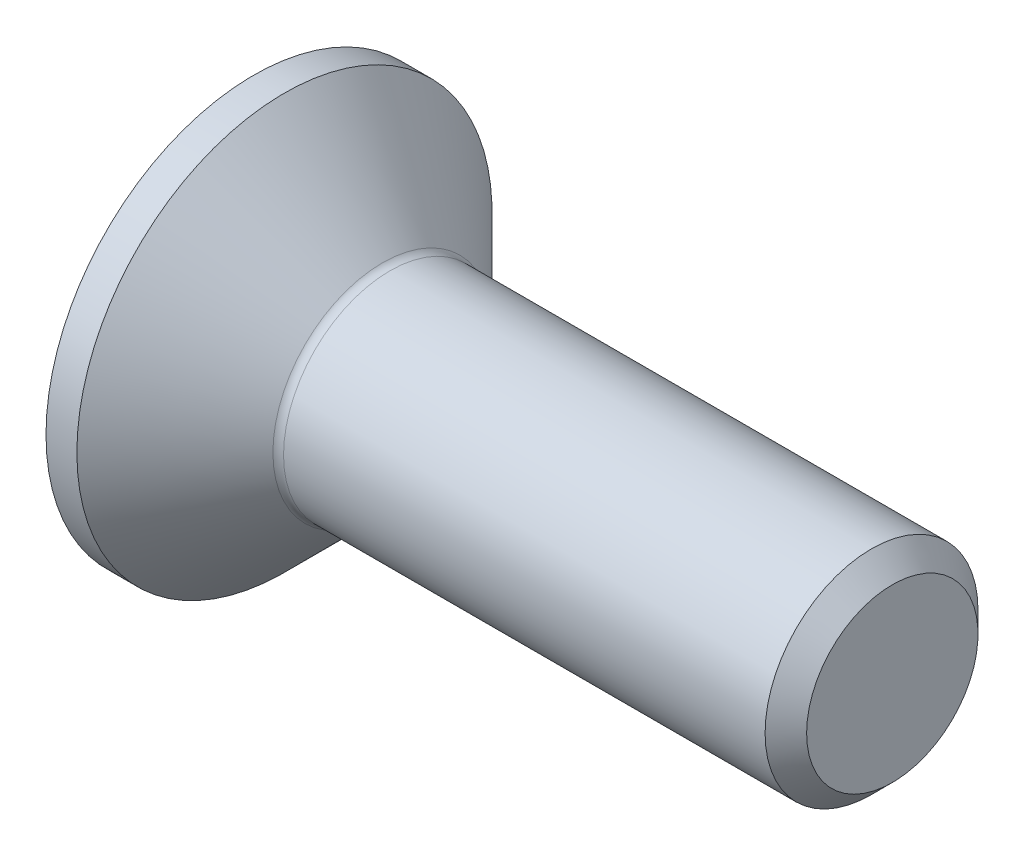
ISO-10303-21;
HEADER;
FILE_DESCRIPTION(('STEP AP214'),'2;1');
FILE_NAME('part.step','',(''),(''),'','','');
FILE_SCHEMA(('AUTOMOTIVE_DESIGN { 1 0 10303 214 1 1 1 1 }'));
ENDSEC;
DATA;
#1=APPLICATION_CONTEXT('core data for automotive mechanical design processes');
#2=APPLICATION_PROTOCOL_DEFINITION('international standard','automotive_design',2000,#1);
#3=PRODUCT_CONTEXT('',#1,'mechanical');
#4=PRODUCT('Part','Part','',(#3));
#5=PRODUCT_RELATED_PRODUCT_CATEGORY('part','',(#4));
#6=PRODUCT_DEFINITION_FORMATION('','',#4);
#7=PRODUCT_DEFINITION_CONTEXT('part definition',#1,'design');
#8=PRODUCT_DEFINITION('design','',#6,#7);
#9=PRODUCT_DEFINITION_SHAPE('','',#8);
#10=(LENGTH_UNIT() NAMED_UNIT(*) SI_UNIT(.MILLI.,.METRE.));
#11=(NAMED_UNIT(*) PLANE_ANGLE_UNIT() SI_UNIT($,.RADIAN.));
#12=(NAMED_UNIT(*) SI_UNIT($,.STERADIAN.) SOLID_ANGLE_UNIT());
#13=UNCERTAINTY_MEASURE_WITH_UNIT(LENGTH_MEASURE(1.E-05),#10,'distance_accuracy_value','');
#14=(GEOMETRIC_REPRESENTATION_CONTEXT(3) GLOBAL_UNCERTAINTY_ASSIGNED_CONTEXT((#13)) GLOBAL_UNIT_ASSIGNED_CONTEXT((#10,
#11,#12)) REPRESENTATION_CONTEXT('',''));
#15=CARTESIAN_POINT('',(0.,0.,0.));
#16=DIRECTION('',(0.,0.,1.));
#17=DIRECTION('',(1.,0.,0.));
#18=AXIS2_PLACEMENT_3D('',#15,#16,#17);
#19=CARTESIAN_POINT('',(0.,0.,0.));
#20=DIRECTION('',(-1.,0.,0.));
#21=DIRECTION('',(0.,0.,1.));
#22=AXIS2_PLACEMENT_3D('',#19,#20,#21);
#23=PLANE('',#22);
#24=CARTESIAN_POINT('',(0.,0.,0.));
#25=DIRECTION('',(-1.,0.,0.));
#26=DIRECTION('',(0.,0.,1.));
#27=AXIS2_PLACEMENT_3D('',#24,#25,#26);
#28=CIRCLE('',#27,3.9);
#29=CARTESIAN_POINT('',(0.,0.,3.9));
#30=VERTEX_POINT('',#29);
#31=EDGE_CURVE('E183',#30,#30,#28,.T.);
#32=ORIENTED_EDGE('',*,*,#31,.T.);
#33=EDGE_LOOP('',(#32));
#34=FACE_BOUND('',#33,.T.);
#35=DIRECTION('',(0.,-0.5,-0.866025403784438));
#36=VECTOR('',#35,1.);
#37=CARTESIAN_POINT('',(0.,-0.721687836487032,1.25));
#38=LINE('',#37,#36);
#39=CARTESIAN_POINT('',(0.,-0.721687836487032,1.25));
#40=VERTEX_POINT('',#39);
#41=CARTESIAN_POINT('',(0.,-1.44337567297407,0.));
#42=VERTEX_POINT('',#41);
#43=EDGE_CURVE('E137',#40,#42,#38,.T.);
#44=ORIENTED_EDGE('',*,*,#43,.T.);
#45=DIRECTION('',(0.,0.5,-0.866025403784438));
#46=VECTOR('',#45,1.);
#47=CARTESIAN_POINT('',(0.,-1.44337567297407,0.));
#48=LINE('',#47,#46);
#49=CARTESIAN_POINT('',(0.,-0.721687836487032,-1.25));
#50=VERTEX_POINT('',#49);
#51=EDGE_CURVE('E66',#42,#50,#48,.T.);
#52=ORIENTED_EDGE('',*,*,#51,.T.);
#53=DIRECTION('',(0.,1.,0.));
#54=VECTOR('',#53,1.);
#55=CARTESIAN_POINT('',(0.,-0.721687836487032,-1.25));
#56=LINE('',#55,#54);
#57=CARTESIAN_POINT('',(0.,0.721687836487032,-1.25));
#58=VERTEX_POINT('',#57);
#59=EDGE_CURVE('E153',#50,#58,#56,.T.);
#60=ORIENTED_EDGE('',*,*,#59,.T.);
#61=DIRECTION('',(0.,0.5,0.866025403784438));
#62=VECTOR('',#61,1.);
#63=CARTESIAN_POINT('',(0.,0.721687836487032,-1.25));
#64=LINE('',#63,#62);
#65=CARTESIAN_POINT('',(0.,1.44337567297406,0.));
#66=VERTEX_POINT('',#65);
#67=EDGE_CURVE('E311',#58,#66,#64,.T.);
#68=ORIENTED_EDGE('',*,*,#67,.T.);
#69=DIRECTION('',(0.,-0.5,0.866025403784439));
#70=VECTOR('',#69,1.);
#71=CARTESIAN_POINT('',(0.,1.44337567297406,0.));
#72=LINE('',#71,#70);
#73=CARTESIAN_POINT('',(0.,0.721687836487032,1.25));
#74=VERTEX_POINT('',#73);
#75=EDGE_CURVE('E315',#66,#74,#72,.T.);
#76=ORIENTED_EDGE('',*,*,#75,.T.);
#77=DIRECTION('',(0.,-1.,0.));
#78=VECTOR('',#77,1.);
#79=CARTESIAN_POINT('',(0.,0.721687836487032,1.25));
#80=LINE('',#79,#78);
#81=EDGE_CURVE('E319',#74,#40,#80,.T.);
#82=ORIENTED_EDGE('',*,*,#81,.T.);
#83=EDGE_LOOP('',(#44,#52,#60,#68,#76,#82));
#84=FACE_BOUND('',#83,.T.);
#85=ADVANCED_FACE('F50',(#34,#84),#23,.T.);
#86=CARTESIAN_POINT('',(0.,0.,0.));
#87=DIRECTION('',(-1.,0.,0.));
#88=DIRECTION('',(0.,0.,1.));
#89=AXIS2_PLACEMENT_3D('',#86,#87,#88);
#90=CYLINDRICAL_SURFACE('',#89,3.9);
#91=CARTESIAN_POINT('',(0.580000000000009,0.,0.));
#92=DIRECTION('',(-1.,0.,0.));
#93=DIRECTION('',(0.,0.,1.));
#94=AXIS2_PLACEMENT_3D('',#91,#92,#93);
#95=CIRCLE('',#94,3.9);
#96=CARTESIAN_POINT('',(0.580000000000009,0.,3.9));
#97=VERTEX_POINT('',#96);
#98=EDGE_CURVE('E179',#97,#97,#95,.T.);
#99=ORIENTED_EDGE('',*,*,#98,.T.);
#100=EDGE_LOOP('',(#99));
#101=FACE_BOUND('',#100,.T.);
#102=ORIENTED_EDGE('',*,*,#31,.F.);
#103=EDGE_LOOP('',(#102));
#104=FACE_BOUND('',#103,.T.);
#105=ADVANCED_FACE('F206',(#101,#104),#90,.T.);
#106=CARTESIAN_POINT('',(0.580000000000009,0.,0.));
#107=DIRECTION('',(-1.,0.,0.));
#108=DIRECTION('',(0.,0.,1.));
#109=AXIS2_PLACEMENT_3D('',#106,#107,#108);
#110=CONICAL_SURFACE('',#109,3.9,0.78539816339745);
#111=CARTESIAN_POINT('',(2.42142135623732,0.,0.));
#112=DIRECTION('',(-1.,0.,0.));
#113=DIRECTION('',(0.,0.,1.));
#114=AXIS2_PLACEMENT_3D('',#111,#112,#113);
#115=CIRCLE('',#114,2.05857864376268);
#116=CARTESIAN_POINT('',(2.42142135623732,0.,2.05857864376268));
#117=VERTEX_POINT('',#116);
#118=EDGE_CURVE('E59',#117,#117,#115,.T.);
#119=ORIENTED_EDGE('',*,*,#118,.T.);
#120=EDGE_LOOP('',(#119));
#121=FACE_BOUND('',#120,.T.);
#122=ORIENTED_EDGE('',*,*,#98,.F.);
#123=EDGE_LOOP('',(#122));
#124=FACE_BOUND('',#123,.T.);
#125=ADVANCED_FACE('F190',(#121,#124),#110,.T.);
#126=CARTESIAN_POINT('',(0.,0.,0.));
#127=DIRECTION('',(-1.,0.,0.));
#128=DIRECTION('',(0.,0.,1.));
#129=AXIS2_PLACEMENT_3D('',#126,#127,#128);
#130=CYLINDRICAL_SURFACE('',#129,1.99999999999999);
#131=CARTESIAN_POINT('',(2.56284271247463,0.,0.));
#132=DIRECTION('',(-1.,0.,0.));
#133=DIRECTION('',(0.,0.,1.));
#134=AXIS2_PLACEMENT_3D('',#131,#132,#133);
#135=CIRCLE('',#134,1.99999999999999);
#136=CARTESIAN_POINT('',(2.56284271247463,0.,1.99999999999999));
#137=VERTEX_POINT('',#136);
#138=EDGE_CURVE('E11',#137,#137,#135,.F.);
#139=ORIENTED_EDGE('',*,*,#138,.T.);
#140=EDGE_LOOP('',(#139));
#141=FACE_BOUND('',#140,.T.);
#142=CARTESIAN_POINT('',(11.61,0.,0.));
#143=DIRECTION('',(-1.,0.,0.));
#144=DIRECTION('',(0.,0.,1.));
#145=AXIS2_PLACEMENT_3D('',#142,#143,#144);
#146=CIRCLE('',#145,1.99999999999997);
#147=CARTESIAN_POINT('',(11.61,0.,1.99999999999997));
#148=VERTEX_POINT('',#147);
#149=EDGE_CURVE('E175',#148,#148,#146,.T.);
#150=ORIENTED_EDGE('',*,*,#149,.T.);
#151=EDGE_LOOP('',(#150));
#152=FACE_BOUND('',#151,.T.);
#153=ADVANCED_FACE('F217',(#141,#152),#130,.T.);
#154=CARTESIAN_POINT('',(12.,0.,0.));
#155=DIRECTION('',(-1.,0.,0.));
#156=DIRECTION('',(0.,0.,1.));
#157=AXIS2_PLACEMENT_3D('',#154,#155,#156);
#158=CONICAL_SURFACE('',#157,1.61,0.785398163397395);
#159=ORIENTED_EDGE('',*,*,#149,.F.);
#160=EDGE_LOOP('',(#159));
#161=FACE_BOUND('',#160,.T.);
#162=CARTESIAN_POINT('',(12.,0.,0.));
#163=DIRECTION('',(-1.,0.,0.));
#164=DIRECTION('',(0.,0.,1.));
#165=AXIS2_PLACEMENT_3D('',#162,#163,#164);
#166=CIRCLE('',#165,1.61);
#167=CARTESIAN_POINT('',(12.,0.,1.61));
#168=VERTEX_POINT('',#167);
#169=EDGE_CURVE('E170',#168,#168,#166,.T.);
#170=ORIENTED_EDGE('',*,*,#169,.T.);
#171=EDGE_LOOP('',(#170));
#172=FACE_BOUND('',#171,.T.);
#173=ADVANCED_FACE('F201',(#161,#172),#158,.T.);
#174=CARTESIAN_POINT('',(12.,1.61,0.));
#175=DIRECTION('',(1.,0.,0.));
#176=DIRECTION('',(0.,0.,-1.));
#177=AXIS2_PLACEMENT_3D('',#174,#175,#176);
#178=PLANE('',#177);
#179=ORIENTED_EDGE('',*,*,#169,.F.);
#180=EDGE_LOOP('',(#179));
#181=FACE_BOUND('',#180,.T.);
#182=ADVANCED_FACE('F194',(#181),#178,.T.);
#183=CARTESIAN_POINT('',(2.56284271247463,0.,0.));
#184=DIRECTION('',(-1.,0.,0.));
#185=DIRECTION('',(0.,0.,1.));
#186=AXIS2_PLACEMENT_3D('',#183,#184,#185);
#187=TOROIDAL_SURFACE('',#186,2.19999999999999,0.2);
#188=ORIENTED_EDGE('',*,*,#138,.F.);
#189=EDGE_LOOP('',(#188));
#190=FACE_BOUND('',#189,.T.);
#191=ORIENTED_EDGE('',*,*,#118,.F.);
#192=EDGE_LOOP('',(#191));
#193=FACE_BOUND('',#192,.T.);
#194=ADVANCED_FACE('F52',(#190,#193),#187,.F.);
#195=CARTESIAN_POINT('',(1.5,-1.44337567297407,0.));
#196=DIRECTION('',(0.,0.866025403784438,0.5));
#197=DIRECTION('',(0.,-0.5,0.866025403784439));
#198=AXIS2_PLACEMENT_3D('',#195,#196,#197);
#199=PLANE('',#198);
#200=ORIENTED_EDGE('',*,*,#51,.F.);
#201=DIRECTION('',(-1.,0.,0.));
#202=VECTOR('',#201,1.);
#203=CARTESIAN_POINT('',(1.5,-1.44337567297407,0.));
#204=LINE('',#203,#202);
#205=CARTESIAN_POINT('',(1.5,-1.44337567297407,0.));
#206=VERTEX_POINT('',#205);
#207=EDGE_CURVE('E306',#206,#42,#204,.T.);
#208=ORIENTED_EDGE('',*,*,#207,.F.);
#209=DIRECTION('',(0.,0.5,-0.866025403784438));
#210=VECTOR('',#209,1.);
#211=CARTESIAN_POINT('',(1.5,-1.44337567297407,0.));
#212=LINE('',#211,#210);
#213=CARTESIAN_POINT('',(1.5,-1.08253175473055,-0.625000000000001));
#214=VERTEX_POINT('',#213);
#215=EDGE_CURVE('E133',#206,#214,#212,.T.);
#216=ORIENTED_EDGE('',*,*,#215,.T.);
#217=CARTESIAN_POINT('',(1.5,-0.721687836487032,-1.25));
#218=VERTEX_POINT('',#217);
#219=EDGE_CURVE('E127',#214,#218,#212,.T.);
#220=ORIENTED_EDGE('',*,*,#219,.T.);
#221=DIRECTION('',(-1.,0.,0.));
#222=VECTOR('',#221,1.);
#223=CARTESIAN_POINT('',(1.5,-0.721687836487032,-1.25));
#224=LINE('',#223,#222);
#225=EDGE_CURVE('E131',#218,#50,#224,.T.);
#226=ORIENTED_EDGE('',*,*,#225,.T.);
#227=EDGE_LOOP('',(#200,#208,#216,#220,#226));
#228=FACE_BOUND('',#227,.T.);
#229=ADVANCED_FACE('F129',(#228),#199,.T.);
#230=CARTESIAN_POINT('',(1.5,-0.721687836487032,-1.25));
#231=DIRECTION('',(0.,0.,1.));
#232=DIRECTION('',(0.,-1.,0.));
#233=AXIS2_PLACEMENT_3D('',#230,#231,#232);
#234=PLANE('',#233);
#235=ORIENTED_EDGE('',*,*,#59,.F.);
#236=ORIENTED_EDGE('',*,*,#225,.F.);
#237=DIRECTION('',(0.,1.,0.));
#238=VECTOR('',#237,1.);
#239=CARTESIAN_POINT('',(1.5,-0.721687836487032,-1.25));
#240=LINE('',#239,#238);
#241=CARTESIAN_POINT('',(1.5,0.,-1.25));
#242=VERTEX_POINT('',#241);
#243=EDGE_CURVE('E140',#218,#242,#240,.T.);
#244=ORIENTED_EDGE('',*,*,#243,.T.);
#245=CARTESIAN_POINT('',(1.5,0.721687836487032,-1.25));
#246=VERTEX_POINT('',#245);
#247=EDGE_CURVE('E148',#242,#246,#240,.T.);
#248=ORIENTED_EDGE('',*,*,#247,.T.);
#249=DIRECTION('',(-1.,0.,0.));
#250=VECTOR('',#249,1.);
#251=CARTESIAN_POINT('',(1.5,0.721687836487032,-1.25));
#252=LINE('',#251,#250);
#253=EDGE_CURVE('E156',#246,#58,#252,.T.);
#254=ORIENTED_EDGE('',*,*,#253,.T.);
#255=EDGE_LOOP('',(#235,#236,#244,#248,#254));
#256=FACE_BOUND('',#255,.T.);
#257=ADVANCED_FACE('F150',(#256),#234,.T.);
#258=CARTESIAN_POINT('',(1.5,0.721687836487032,-1.25));
#259=DIRECTION('',(0.,-0.866025403784439,0.5));
#260=DIRECTION('',(0.,-0.5,-0.866025403784439));
#261=AXIS2_PLACEMENT_3D('',#258,#259,#260);
#262=PLANE('',#261);
#263=ORIENTED_EDGE('',*,*,#67,.F.);
#264=ORIENTED_EDGE('',*,*,#253,.F.);
#265=DIRECTION('',(0.,0.5,0.866025403784438));
#266=VECTOR('',#265,1.);
#267=CARTESIAN_POINT('',(1.5,0.721687836487032,-1.25));
#268=LINE('',#267,#266);
#269=CARTESIAN_POINT('',(1.5,1.08253175473055,-0.625));
#270=VERTEX_POINT('',#269);
#271=EDGE_CURVE('E294',#246,#270,#268,.T.);
#272=ORIENTED_EDGE('',*,*,#271,.T.);
#273=CARTESIAN_POINT('',(1.5,1.44337567297406,0.));
#274=VERTEX_POINT('',#273);
#275=EDGE_CURVE('E147',#270,#274,#268,.T.);
#276=ORIENTED_EDGE('',*,*,#275,.T.);
#277=DIRECTION('',(-1.,0.,0.));
#278=VECTOR('',#277,1.);
#279=CARTESIAN_POINT('',(1.5,1.44337567297406,0.));
#280=LINE('',#279,#278);
#281=EDGE_CURVE('E164',#274,#66,#280,.T.);
#282=ORIENTED_EDGE('',*,*,#281,.T.);
#283=EDGE_LOOP('',(#263,#264,#272,#276,#282));
#284=FACE_BOUND('',#283,.T.);
#285=ADVANCED_FACE('F231',(#284),#262,.T.);
#286=CARTESIAN_POINT('',(1.5,1.44337567297406,0.));
#287=DIRECTION('',(0.,-0.866025403784438,-0.5));
#288=DIRECTION('',(0.,0.5,-0.866025403784439));
#289=AXIS2_PLACEMENT_3D('',#286,#287,#288);
#290=PLANE('',#289);
#291=ORIENTED_EDGE('',*,*,#75,.F.);
#292=ORIENTED_EDGE('',*,*,#281,.F.);
#293=DIRECTION('',(0.,-0.5,0.866025403784439));
#294=VECTOR('',#293,1.);
#295=CARTESIAN_POINT('',(1.5,1.44337567297406,0.));
#296=LINE('',#295,#294);
#297=CARTESIAN_POINT('',(1.5,1.08253175473055,0.625));
#298=VERTEX_POINT('',#297);
#299=EDGE_CURVE('E74',#274,#298,#296,.T.);
#300=ORIENTED_EDGE('',*,*,#299,.T.);
#301=CARTESIAN_POINT('',(1.5,0.721687836487032,1.25));
#302=VERTEX_POINT('',#301);
#303=EDGE_CURVE('E266',#298,#302,#296,.T.);
#304=ORIENTED_EDGE('',*,*,#303,.T.);
#305=DIRECTION('',(-1.,0.,0.));
#306=VECTOR('',#305,1.);
#307=CARTESIAN_POINT('',(1.5,0.721687836487032,1.25));
#308=LINE('',#307,#306);
#309=EDGE_CURVE('E281',#302,#74,#308,.T.);
#310=ORIENTED_EDGE('',*,*,#309,.T.);
#311=EDGE_LOOP('',(#291,#292,#300,#304,#310));
#312=FACE_BOUND('',#311,.T.);
#313=ADVANCED_FACE('F234',(#312),#290,.T.);
#314=CARTESIAN_POINT('',(1.5,0.721687836487032,1.25));
#315=DIRECTION('',(0.,0.,-1.));
#316=DIRECTION('',(-1.,0.,0.));
#317=AXIS2_PLACEMENT_3D('',#314,#315,#316);
#318=PLANE('',#317);
#319=ORIENTED_EDGE('',*,*,#81,.F.);
#320=ORIENTED_EDGE('',*,*,#309,.F.);
#321=DIRECTION('',(0.,-1.,0.));
#322=VECTOR('',#321,1.);
#323=CARTESIAN_POINT('',(1.5,0.721687836487032,1.25));
#324=LINE('',#323,#322);
#325=CARTESIAN_POINT('',(1.5,0.,1.25));
#326=VERTEX_POINT('',#325);
#327=EDGE_CURVE('E265',#302,#326,#324,.T.);
#328=ORIENTED_EDGE('',*,*,#327,.T.);
#329=CARTESIAN_POINT('',(1.5,-0.721687836487032,1.25));
#330=VERTEX_POINT('',#329);
#331=EDGE_CURVE('E271',#326,#330,#324,.T.);
#332=ORIENTED_EDGE('',*,*,#331,.T.);
#333=DIRECTION('',(-1.,0.,0.));
#334=VECTOR('',#333,1.);
#335=CARTESIAN_POINT('',(1.5,-0.721687836487032,1.25));
#336=LINE('',#335,#334);
#337=EDGE_CURVE('E328',#330,#40,#336,.T.);
#338=ORIENTED_EDGE('',*,*,#337,.T.);
#339=EDGE_LOOP('',(#319,#320,#328,#332,#338));
#340=FACE_BOUND('',#339,.T.);
#341=ADVANCED_FACE('F238',(#340),#318,.T.);
#342=CARTESIAN_POINT('',(1.5,-0.721687836487032,1.25));
#343=DIRECTION('',(0.,0.866025403784438,-0.5));
#344=DIRECTION('',(0.,0.5,0.866025403784439));
#345=AXIS2_PLACEMENT_3D('',#342,#343,#344);
#346=PLANE('',#345);
#347=ORIENTED_EDGE('',*,*,#43,.F.);
#348=ORIENTED_EDGE('',*,*,#337,.F.);
#349=DIRECTION('',(0.,-0.5,-0.866025403784438));
#350=VECTOR('',#349,1.);
#351=CARTESIAN_POINT('',(1.5,-0.721687836487032,1.25));
#352=LINE('',#351,#350);
#353=CARTESIAN_POINT('',(1.5,-1.08253175473055,0.625000000000001));
#354=VERTEX_POINT('',#353);
#355=EDGE_CURVE('E274',#330,#354,#352,.T.);
#356=ORIENTED_EDGE('',*,*,#355,.T.);
#357=EDGE_CURVE('E283',#354,#206,#352,.T.);
#358=ORIENTED_EDGE('',*,*,#357,.T.);
#359=ORIENTED_EDGE('',*,*,#207,.T.);
#360=EDGE_LOOP('',(#347,#348,#356,#358,#359));
#361=FACE_BOUND('',#360,.T.);
#362=ADVANCED_FACE('F241',(#361),#346,.T.);
#363=CARTESIAN_POINT('',(1.5,-1.44337567297407,0.));
#364=DIRECTION('',(-1.,0.,0.));
#365=DIRECTION('',(0.,0.,1.));
#366=AXIS2_PLACEMENT_3D('',#363,#364,#365);
#367=PLANE('',#366);
#368=CARTESIAN_POINT('',(1.5,0.,0.));
#369=DIRECTION('',(-1.,0.,0.));
#370=DIRECTION('',(0.,0.,1.));
#371=AXIS2_PLACEMENT_3D('',#368,#369,#370);
#372=CIRCLE('',#371,1.25);
#373=EDGE_CURVE('E155',#354,#326,#372,.T.);
#374=ORIENTED_EDGE('',*,*,#373,.F.);
#375=ORIENTED_EDGE('',*,*,#355,.F.);
#376=ORIENTED_EDGE('',*,*,#331,.F.);
#377=EDGE_LOOP('',(#374,#375,#376));
#378=FACE_BOUND('',#377,.T.);
#379=ADVANCED_FACE('F245',(#378),#367,.T.);
#380=EDGE_CURVE('E161',#214,#354,#372,.T.);
#381=ORIENTED_EDGE('',*,*,#380,.F.);
#382=ORIENTED_EDGE('',*,*,#215,.F.);
#383=ORIENTED_EDGE('',*,*,#357,.F.);
#384=EDGE_LOOP('',(#381,#382,#383));
#385=FACE_BOUND('',#384,.T.);
#386=ADVANCED_FACE('F248',(#385),#367,.T.);
#387=EDGE_CURVE('E142',#242,#214,#372,.T.);
#388=ORIENTED_EDGE('',*,*,#387,.F.);
#389=ORIENTED_EDGE('',*,*,#243,.F.);
#390=ORIENTED_EDGE('',*,*,#219,.F.);
#391=EDGE_LOOP('',(#388,#389,#390));
#392=FACE_BOUND('',#391,.T.);
#393=ADVANCED_FACE('F141',(#392),#367,.T.);
#394=EDGE_CURVE('E287',#270,#242,#372,.T.);
#395=ORIENTED_EDGE('',*,*,#394,.F.);
#396=ORIENTED_EDGE('',*,*,#271,.F.);
#397=ORIENTED_EDGE('',*,*,#247,.F.);
#398=EDGE_LOOP('',(#395,#396,#397));
#399=FACE_BOUND('',#398,.T.);
#400=ADVANCED_FACE('F260',(#399),#367,.T.);
#401=EDGE_CURVE('E171',#298,#270,#372,.T.);
#402=ORIENTED_EDGE('',*,*,#401,.F.);
#403=ORIENTED_EDGE('',*,*,#299,.F.);
#404=ORIENTED_EDGE('',*,*,#275,.F.);
#405=EDGE_LOOP('',(#402,#403,#404));
#406=FACE_BOUND('',#405,.T.);
#407=ADVANCED_FACE('F255',(#406),#367,.T.);
#408=EDGE_CURVE('E163',#326,#298,#372,.T.);
#409=ORIENTED_EDGE('',*,*,#408,.F.);
#410=ORIENTED_EDGE('',*,*,#327,.F.);
#411=ORIENTED_EDGE('',*,*,#303,.F.);
#412=EDGE_LOOP('',(#409,#410,#411));
#413=FACE_BOUND('',#412,.T.);
#414=ADVANCED_FACE('F226',(#413),#367,.T.);
#415=CARTESIAN_POINT('',(1.5,0.,0.));
#416=DIRECTION('',(-1.,0.,0.));
#417=DIRECTION('',(0.,0.,1.));
#418=AXIS2_PLACEMENT_3D('',#415,#416,#417);
#419=CONICAL_SURFACE('',#418,1.25,1.04719755119659);
#420=CARTESIAN_POINT('',(2.22168783648704,0.,0.));
#421=VERTEX_POINT('',#420);
#422=VERTEX_LOOP('',#421);
#423=FACE_BOUND('',#422,.T.);
#424=ORIENTED_EDGE('',*,*,#408,.T.);
#425=ORIENTED_EDGE('',*,*,#401,.T.);
#426=ORIENTED_EDGE('',*,*,#394,.T.);
#427=ORIENTED_EDGE('',*,*,#387,.T.);
#428=ORIENTED_EDGE('',*,*,#380,.T.);
#429=ORIENTED_EDGE('',*,*,#373,.T.);
#430=EDGE_LOOP('',(#424,#425,#426,#427,#428,#429));
#431=FACE_BOUND('',#430,.T.);
#432=ADVANCED_FACE('F224',(#423,#431),#419,.F.);
#433=CLOSED_SHELL('',(#85,#105,#125,#153,#173,#182,#194,#229,#257,#285,#313,#341,#362,#379,#386,
#393,#400,#407,#414,#432));
#434=MANIFOLD_SOLID_BREP('B2',#433);
#435=ADVANCED_BREP_SHAPE_REPRESENTATION('',(#18,#434),#14);
#436=SHAPE_DEFINITION_REPRESENTATION(#9,#435);
ENDSEC;
END-ISO-10303-21;
